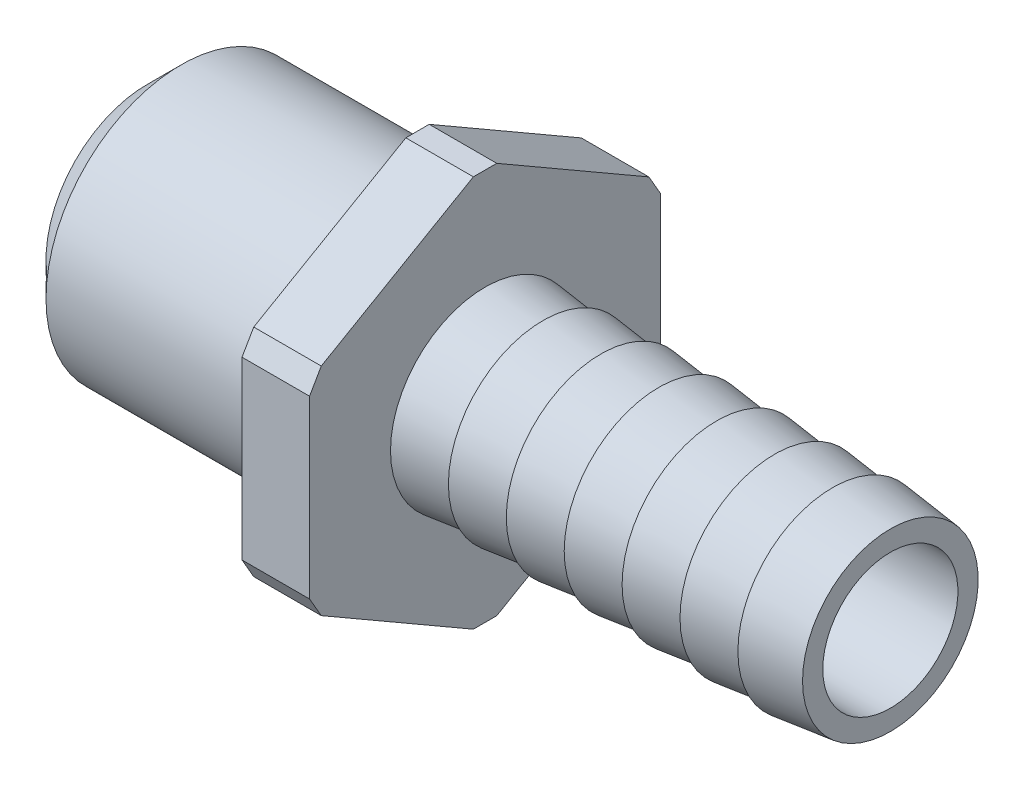
ISO-10303-21;
HEADER;
FILE_DESCRIPTION(('STEP AP214'),'2;1');
FILE_NAME('part.step','',(''),(''),'','','');
FILE_SCHEMA(('AUTOMOTIVE_DESIGN { 1 0 10303 214 1 1 1 1 }'));
ENDSEC;
DATA;
#1=APPLICATION_CONTEXT('core data for automotive mechanical design processes');
#2=APPLICATION_PROTOCOL_DEFINITION('international standard','automotive_design',2000,#1);
#3=PRODUCT_CONTEXT('',#1,'mechanical');
#4=PRODUCT('Part','Part','',(#3));
#5=PRODUCT_RELATED_PRODUCT_CATEGORY('part','',(#4));
#6=PRODUCT_DEFINITION_FORMATION('','',#4);
#7=PRODUCT_DEFINITION_CONTEXT('part definition',#1,'design');
#8=PRODUCT_DEFINITION('design','',#6,#7);
#9=PRODUCT_DEFINITION_SHAPE('','',#8);
#10=(LENGTH_UNIT() NAMED_UNIT(*) SI_UNIT(.MILLI.,.METRE.));
#11=(NAMED_UNIT(*) PLANE_ANGLE_UNIT() SI_UNIT($,.RADIAN.));
#12=(NAMED_UNIT(*) SI_UNIT($,.STERADIAN.) SOLID_ANGLE_UNIT());
#13=UNCERTAINTY_MEASURE_WITH_UNIT(LENGTH_MEASURE(1.E-05),#10,'distance_accuracy_value','');
#14=(GEOMETRIC_REPRESENTATION_CONTEXT(3) GLOBAL_UNCERTAINTY_ASSIGNED_CONTEXT((#13)) GLOBAL_UNIT_ASSIGNED_CONTEXT((#10,
#11,#12)) REPRESENTATION_CONTEXT('',''));
#15=CARTESIAN_POINT('',(0.,0.,0.));
#16=DIRECTION('',(0.,0.,1.));
#17=DIRECTION('',(1.,0.,0.));
#18=AXIS2_PLACEMENT_3D('',#15,#16,#17);
#19=CARTESIAN_POINT('',(4.,2.,0.));
#20=DIRECTION('',(1.,0.,0.));
#21=DIRECTION('',(0.,0.,-1.));
#22=AXIS2_PLACEMENT_3D('',#19,#20,#21);
#23=PLANE('',#22);
#24=CARTESIAN_POINT('',(4.,0.,0.));
#25=DIRECTION('',(-1.,0.,0.));
#26=DIRECTION('',(0.,0.,1.));
#27=AXIS2_PLACEMENT_3D('',#24,#25,#26);
#28=CIRCLE('',#27,2.);
#29=CARTESIAN_POINT('',(4.,0.,2.));
#30=VERTEX_POINT('',#29);
#31=EDGE_CURVE('E269',#30,#30,#28,.T.);
#32=ORIENTED_EDGE('',*,*,#31,.F.);
#33=EDGE_LOOP('',(#32));
#34=FACE_BOUND('',#33,.T.);
#35=DIRECTION('',(0.,-0.5,-0.866025403784439));
#36=VECTOR('',#35,1.);
#37=CARTESIAN_POINT('',(4.,3.,0.));
#38=LINE('',#37,#36);
#39=CARTESIAN_POINT('',(4.,2.9,-0.173205080756888));
#40=VERTEX_POINT('',#39);
#41=CARTESIAN_POINT('',(4.,1.6,-2.42487113059643));
#42=VERTEX_POINT('',#41);
#43=EDGE_CURVE('E149',#40,#42,#38,.T.);
#44=ORIENTED_EDGE('',*,*,#43,.T.);
#45=DIRECTION('',(0.,0.866025403784439,0.499999999999999));
#46=VECTOR('',#45,1.);
#47=CARTESIAN_POINT('',(4.,1.6,-2.42487113059643));
#48=LINE('',#47,#46);
#49=CARTESIAN_POINT('',(4.,1.3,-2.59807621135332));
#50=VERTEX_POINT('',#49);
#51=EDGE_CURVE('E294',#42,#50,#48,.F.);
#52=ORIENTED_EDGE('',*,*,#51,.T.);
#53=DIRECTION('',(0.,-1.,0.));
#54=VECTOR('',#53,1.);
#55=CARTESIAN_POINT('',(4.,1.5,-2.59807621135332));
#56=LINE('',#55,#54);
#57=CARTESIAN_POINT('',(4.,-1.3,-2.59807621135332));
#58=VERTEX_POINT('',#57);
#59=EDGE_CURVE('E304',#50,#58,#56,.T.);
#60=ORIENTED_EDGE('',*,*,#59,.T.);
#61=DIRECTION('',(0.,0.866025403784439,-0.499999999999999));
#62=VECTOR('',#61,1.);
#63=CARTESIAN_POINT('',(4.,-1.3,-2.59807621135332));
#64=LINE('',#63,#62);
#65=CARTESIAN_POINT('',(4.,-1.6,-2.42487113059643));
#66=VERTEX_POINT('',#65);
#67=EDGE_CURVE('E292',#58,#66,#64,.F.);
#68=ORIENTED_EDGE('',*,*,#67,.T.);
#69=DIRECTION('',(0.,-0.5,0.866025403784439));
#70=VECTOR('',#69,1.);
#71=CARTESIAN_POINT('',(4.,-1.5,-2.59807621135332));
#72=LINE('',#71,#70);
#73=CARTESIAN_POINT('',(4.,-2.9,-0.173205080756889));
#74=VERTEX_POINT('',#73);
#75=EDGE_CURVE('E221',#66,#74,#72,.T.);
#76=ORIENTED_EDGE('',*,*,#75,.T.);
#77=DIRECTION('',(0.,0.,-1.));
#78=VECTOR('',#77,1.);
#79=CARTESIAN_POINT('',(4.,-2.9,-0.173205080756889));
#80=LINE('',#79,#78);
#81=CARTESIAN_POINT('',(4.,-2.9,0.173205080756888));
#82=VERTEX_POINT('',#81);
#83=EDGE_CURVE('E290',#74,#82,#80,.F.);
#84=ORIENTED_EDGE('',*,*,#83,.T.);
#85=DIRECTION('',(0.,0.5,0.866025403784439));
#86=VECTOR('',#85,1.);
#87=CARTESIAN_POINT('',(4.,-3.,0.));
#88=LINE('',#87,#86);
#89=CARTESIAN_POINT('',(4.,-1.6,2.42487113059643));
#90=VERTEX_POINT('',#89);
#91=EDGE_CURVE('E216',#82,#90,#88,.T.);
#92=ORIENTED_EDGE('',*,*,#91,.T.);
#93=DIRECTION('',(0.,-0.866025403784439,-0.499999999999999));
#94=VECTOR('',#93,1.);
#95=CARTESIAN_POINT('',(4.,-1.6,2.42487113059643));
#96=LINE('',#95,#94);
#97=CARTESIAN_POINT('',(4.,-1.3,2.59807621135331));
#98=VERTEX_POINT('',#97);
#99=EDGE_CURVE('E214',#90,#98,#96,.F.);
#100=ORIENTED_EDGE('',*,*,#99,.T.);
#101=DIRECTION('',(0.,1.,0.));
#102=VECTOR('',#101,1.);
#103=CARTESIAN_POINT('',(4.,-1.5,2.59807621135331));
#104=LINE('',#103,#102);
#105=CARTESIAN_POINT('',(4.,1.3,2.59807621135331));
#106=VERTEX_POINT('',#105);
#107=EDGE_CURVE('E210',#98,#106,#104,.T.);
#108=ORIENTED_EDGE('',*,*,#107,.T.);
#109=DIRECTION('',(0.,-0.866025403784438,0.500000000000002));
#110=VECTOR('',#109,1.);
#111=CARTESIAN_POINT('',(4.,1.3,2.59807621135331));
#112=LINE('',#111,#110);
#113=CARTESIAN_POINT('',(4.,1.6,2.42487113059643));
#114=VERTEX_POINT('',#113);
#115=EDGE_CURVE('E205',#106,#114,#112,.F.);
#116=ORIENTED_EDGE('',*,*,#115,.T.);
#117=DIRECTION('',(0.,0.5,-0.866025403784439));
#118=VECTOR('',#117,1.);
#119=CARTESIAN_POINT('',(4.,1.5,2.59807621135331));
#120=LINE('',#119,#118);
#121=CARTESIAN_POINT('',(4.,2.9,0.173205080756888));
#122=VERTEX_POINT('',#121);
#123=EDGE_CURVE('E197',#114,#122,#120,.T.);
#124=ORIENTED_EDGE('',*,*,#123,.T.);
#125=DIRECTION('',(0.,0.,1.));
#126=VECTOR('',#125,1.);
#127=CARTESIAN_POINT('',(4.,2.9,0.173205080756888));
#128=LINE('',#127,#126);
#129=EDGE_CURVE('E287',#122,#40,#128,.F.);
#130=ORIENTED_EDGE('',*,*,#129,.T.);
#131=EDGE_LOOP('',(#44,#52,#60,#68,#76,#84,#92,#100,#108,#116,#124,#130));
#132=FACE_BOUND('',#131,.T.);
#133=ADVANCED_FACE('F49',(#34,#132),#23,.F.);
#134=CARTESIAN_POINT('',(5.,3.,0.));
#135=DIRECTION('',(-1.,0.,0.));
#136=DIRECTION('',(0.,0.,1.));
#137=AXIS2_PLACEMENT_3D('',#134,#135,#136);
#138=PLANE('',#137);
#139=CARTESIAN_POINT('',(5.,0.,0.));
#140=DIRECTION('',(-1.,0.,0.));
#141=DIRECTION('',(0.,0.,1.));
#142=AXIS2_PLACEMENT_3D('',#139,#140,#141);
#143=CIRCLE('',#142,1.4);
#144=CARTESIAN_POINT('',(5.,0.,1.4));
#145=VERTEX_POINT('',#144);
#146=EDGE_CURVE('E266',#145,#145,#143,.T.);
#147=ORIENTED_EDGE('',*,*,#146,.T.);
#148=EDGE_LOOP('',(#147));
#149=FACE_BOUND('',#148,.T.);
#150=DIRECTION('',(0.,-1.,0.));
#151=VECTOR('',#150,1.);
#152=CARTESIAN_POINT('',(5.,3.,-2.59807621135332));
#153=LINE('',#152,#151);
#154=CARTESIAN_POINT('',(5.,1.3,-2.59807621135332));
#155=VERTEX_POINT('',#154);
#156=CARTESIAN_POINT('',(5.,-1.3,-2.59807621135332));
#157=VERTEX_POINT('',#156);
#158=EDGE_CURVE('E162',#155,#157,#153,.T.);
#159=ORIENTED_EDGE('',*,*,#158,.F.);
#160=DIRECTION('',(0.,-0.866025403784439,-0.499999999999999));
#161=VECTOR('',#160,1.);
#162=CARTESIAN_POINT('',(5.,1.6,-2.42487113059643));
#163=LINE('',#162,#161);
#164=CARTESIAN_POINT('',(5.,1.6,-2.42487113059643));
#165=VERTEX_POINT('',#164);
#166=EDGE_CURVE('E161',#155,#165,#163,.F.);
#167=ORIENTED_EDGE('',*,*,#166,.T.);
#168=DIRECTION('',(0.,-0.5,-0.866025403784439));
#169=VECTOR('',#168,1.);
#170=CARTESIAN_POINT('',(5.,3.,0.));
#171=LINE('',#170,#169);
#172=CARTESIAN_POINT('',(5.,2.9,-0.173205080756888));
#173=VERTEX_POINT('',#172);
#174=EDGE_CURVE('E146',#173,#165,#171,.T.);
#175=ORIENTED_EDGE('',*,*,#174,.F.);
#176=DIRECTION('',(0.,0.,-1.));
#177=VECTOR('',#176,1.);
#178=CARTESIAN_POINT('',(5.,2.9,0.173205080756888));
#179=LINE('',#178,#177);
#180=CARTESIAN_POINT('',(5.,2.9,0.173205080756888));
#181=VERTEX_POINT('',#180);
#182=EDGE_CURVE('E158',#173,#181,#179,.F.);
#183=ORIENTED_EDGE('',*,*,#182,.T.);
#184=DIRECTION('',(0.,0.5,-0.866025403784439));
#185=VECTOR('',#184,1.);
#186=CARTESIAN_POINT('',(5.,3.,0.));
#187=LINE('',#186,#185);
#188=CARTESIAN_POINT('',(5.,1.6,2.42487113059643));
#189=VERTEX_POINT('',#188);
#190=EDGE_CURVE('E153',#189,#181,#187,.T.);
#191=ORIENTED_EDGE('',*,*,#190,.F.);
#192=DIRECTION('',(0.,0.866025403784438,-0.500000000000002));
#193=VECTOR('',#192,1.);
#194=CARTESIAN_POINT('',(5.,1.3,2.59807621135331));
#195=LINE('',#194,#193);
#196=CARTESIAN_POINT('',(5.,1.3,2.59807621135331));
#197=VERTEX_POINT('',#196);
#198=EDGE_CURVE('E168',#189,#197,#195,.F.);
#199=ORIENTED_EDGE('',*,*,#198,.T.);
#200=DIRECTION('',(0.,1.,0.));
#201=VECTOR('',#200,1.);
#202=CARTESIAN_POINT('',(5.,3.,2.59807621135331));
#203=LINE('',#202,#201);
#204=CARTESIAN_POINT('',(5.,-1.3,2.59807621135331));
#205=VERTEX_POINT('',#204);
#206=EDGE_CURVE('E202',#205,#197,#203,.T.);
#207=ORIENTED_EDGE('',*,*,#206,.F.);
#208=DIRECTION('',(0.,0.866025403784439,0.499999999999999));
#209=VECTOR('',#208,1.);
#210=CARTESIAN_POINT('',(5.,-1.6,2.42487113059643));
#211=LINE('',#210,#209);
#212=CARTESIAN_POINT('',(5.,-1.6,2.42487113059643));
#213=VERTEX_POINT('',#212);
#214=EDGE_CURVE('E167',#205,#213,#211,.F.);
#215=ORIENTED_EDGE('',*,*,#214,.T.);
#216=DIRECTION('',(0.,0.5,0.866025403784439));
#217=VECTOR('',#216,1.);
#218=CARTESIAN_POINT('',(5.,-1.5,2.59807621135332));
#219=LINE('',#218,#217);
#220=CARTESIAN_POINT('',(5.,-2.9,0.173205080756887));
#221=VERTEX_POINT('',#220);
#222=EDGE_CURVE('E281',#221,#213,#219,.T.);
#223=ORIENTED_EDGE('',*,*,#222,.F.);
#224=DIRECTION('',(0.,0.,1.));
#225=VECTOR('',#224,1.);
#226=CARTESIAN_POINT('',(5.,-2.9,-0.173205080756889));
#227=LINE('',#226,#225);
#228=CARTESIAN_POINT('',(5.,-2.9,-0.173205080756888));
#229=VERTEX_POINT('',#228);
#230=EDGE_CURVE('E65',#221,#229,#227,.F.);
#231=ORIENTED_EDGE('',*,*,#230,.T.);
#232=DIRECTION('',(0.,-0.5,0.866025403784439));
#233=VECTOR('',#232,1.);
#234=CARTESIAN_POINT('',(5.,-1.5,-2.59807621135332));
#235=LINE('',#234,#233);
#236=CARTESIAN_POINT('',(5.,-1.6,-2.42487113059643));
#237=VERTEX_POINT('',#236);
#238=EDGE_CURVE('E279',#237,#229,#235,.T.);
#239=ORIENTED_EDGE('',*,*,#238,.F.);
#240=DIRECTION('',(0.,-0.866025403784439,0.499999999999999));
#241=VECTOR('',#240,1.);
#242=CARTESIAN_POINT('',(5.,-1.3,-2.59807621135332));
#243=LINE('',#242,#241);
#244=EDGE_CURVE('E176',#237,#157,#243,.F.);
#245=ORIENTED_EDGE('',*,*,#244,.T.);
#246=EDGE_LOOP('',(#159,#167,#175,#183,#191,#199,#207,#215,#223,#231,#239,#245));
#247=FACE_BOUND('',#246,.T.);
#248=ADVANCED_FACE('F156',(#149,#247),#138,.F.);
#249=CARTESIAN_POINT('',(0.,1.,0.));
#250=DIRECTION('',(1.,0.,0.));
#251=DIRECTION('',(0.,0.,-1.));
#252=AXIS2_PLACEMENT_3D('',#249,#250,#251);
#253=PLANE('',#252);
#254=CARTESIAN_POINT('',(0.,0.,0.));
#255=DIRECTION('',(1.,0.,0.));
#256=DIRECTION('',(0.,0.,-1.));
#257=AXIS2_PLACEMENT_3D('',#254,#255,#256);
#258=CIRCLE('',#257,1.5);
#259=CARTESIAN_POINT('',(0.,0.,-1.5));
#260=VERTEX_POINT('',#259);
#261=EDGE_CURVE('E272',#260,#260,#258,.F.);
#262=ORIENTED_EDGE('',*,*,#261,.T.);
#263=EDGE_LOOP('',(#262));
#264=FACE_BOUND('',#263,.T.);
#265=CARTESIAN_POINT('',(0.,0.,0.));
#266=DIRECTION('',(-1.,0.,0.));
#267=DIRECTION('',(0.,0.,1.));
#268=AXIS2_PLACEMENT_3D('',#265,#266,#267);
#269=CIRCLE('',#268,1.);
#270=CARTESIAN_POINT('',(0.,0.,1.));
#271=VERTEX_POINT('',#270);
#272=EDGE_CURVE('E215',#271,#271,#269,.T.);
#273=ORIENTED_EDGE('',*,*,#272,.F.);
#274=EDGE_LOOP('',(#273));
#275=FACE_BOUND('',#274,.T.);
#276=ADVANCED_FACE('F336',(#264,#275),#253,.F.);
#277=CARTESIAN_POINT('',(0.,0.,0.));
#278=DIRECTION('',(-1.,0.,0.));
#279=DIRECTION('',(0.,0.,1.));
#280=AXIS2_PLACEMENT_3D('',#277,#278,#279);
#281=CYLINDRICAL_SURFACE('',#280,2.);
#282=CARTESIAN_POINT('',(0.5,0.,0.));
#283=DIRECTION('',(1.,0.,0.));
#284=DIRECTION('',(0.,0.,-1.));
#285=AXIS2_PLACEMENT_3D('',#282,#283,#284);
#286=CIRCLE('',#285,2.);
#287=CARTESIAN_POINT('',(0.5,0.,-2.));
#288=VERTEX_POINT('',#287);
#289=EDGE_CURVE('E163',#288,#288,#286,.T.);
#290=ORIENTED_EDGE('',*,*,#289,.T.);
#291=EDGE_LOOP('',(#290));
#292=FACE_BOUND('',#291,.T.);
#293=ORIENTED_EDGE('',*,*,#31,.T.);
#294=EDGE_LOOP('',(#293));
#295=FACE_BOUND('',#294,.T.);
#296=ADVANCED_FACE('F342',(#292,#295),#281,.T.);
#297=CARTESIAN_POINT('',(5.85714285714286,0.,0.));
#298=DIRECTION('',(-1.,0.,0.));
#299=DIRECTION('',(0.,0.,1.));
#300=AXIS2_PLACEMENT_3D('',#297,#298,#299);
#301=CONICAL_SURFACE('',#300,1.3,0.11614162687999);
#302=ORIENTED_EDGE('',*,*,#146,.F.);
#303=EDGE_LOOP('',(#302));
#304=FACE_BOUND('',#303,.T.);
#305=CARTESIAN_POINT('',(5.85714285714286,0.,0.));
#306=DIRECTION('',(-1.,0.,0.));
#307=DIRECTION('',(0.,0.,1.));
#308=AXIS2_PLACEMENT_3D('',#305,#306,#307);
#309=CIRCLE('',#308,1.3);
#310=CARTESIAN_POINT('',(5.85714285714286,0.,1.3));
#311=VERTEX_POINT('',#310);
#312=EDGE_CURVE('E263',#311,#311,#309,.T.);
#313=ORIENTED_EDGE('',*,*,#312,.T.);
#314=EDGE_LOOP('',(#313));
#315=FACE_BOUND('',#314,.T.);
#316=ADVANCED_FACE('F345',(#304,#315),#301,.T.);
#317=CARTESIAN_POINT('',(5.85714285714286,1.4,0.));
#318=DIRECTION('',(1.,0.,0.));
#319=DIRECTION('',(0.,0.,-1.));
#320=AXIS2_PLACEMENT_3D('',#317,#318,#319);
#321=PLANE('',#320);
#322=ORIENTED_EDGE('',*,*,#312,.F.);
#323=EDGE_LOOP('',(#322));
#324=FACE_BOUND('',#323,.T.);
#325=CARTESIAN_POINT('',(5.85714285714286,0.,0.));
#326=DIRECTION('',(-1.,0.,0.));
#327=DIRECTION('',(0.,0.,1.));
#328=AXIS2_PLACEMENT_3D('',#325,#326,#327);
#329=CIRCLE('',#328,1.4);
#330=CARTESIAN_POINT('',(5.85714285714286,0.,1.4));
#331=VERTEX_POINT('',#330);
#332=EDGE_CURVE('E260',#331,#331,#329,.T.);
#333=ORIENTED_EDGE('',*,*,#332,.T.);
#334=EDGE_LOOP('',(#333));
#335=FACE_BOUND('',#334,.T.);
#336=ADVANCED_FACE('F452',(#324,#335),#321,.F.);
#337=CARTESIAN_POINT('',(6.71428571428571,0.,0.));
#338=DIRECTION('',(-1.,0.,0.));
#339=DIRECTION('',(0.,0.,1.));
#340=AXIS2_PLACEMENT_3D('',#337,#338,#339);
#341=CONICAL_SURFACE('',#340,1.3,0.11614162687999);
#342=ORIENTED_EDGE('',*,*,#332,.F.);
#343=EDGE_LOOP('',(#342));
#344=FACE_BOUND('',#343,.T.);
#345=CARTESIAN_POINT('',(6.71428571428571,0.,0.));
#346=DIRECTION('',(-1.,0.,0.));
#347=DIRECTION('',(0.,0.,1.));
#348=AXIS2_PLACEMENT_3D('',#345,#346,#347);
#349=CIRCLE('',#348,1.3);
#350=CARTESIAN_POINT('',(6.71428571428571,0.,1.3));
#351=VERTEX_POINT('',#350);
#352=EDGE_CURVE('E257',#351,#351,#349,.T.);
#353=ORIENTED_EDGE('',*,*,#352,.T.);
#354=EDGE_LOOP('',(#353));
#355=FACE_BOUND('',#354,.T.);
#356=ADVANCED_FACE('F448',(#344,#355),#341,.T.);
#357=CARTESIAN_POINT('',(6.71428571428571,1.4,0.));
#358=DIRECTION('',(1.,0.,0.));
#359=DIRECTION('',(0.,0.,-1.));
#360=AXIS2_PLACEMENT_3D('',#357,#358,#359);
#361=PLANE('',#360);
#362=ORIENTED_EDGE('',*,*,#352,.F.);
#363=EDGE_LOOP('',(#362));
#364=FACE_BOUND('',#363,.T.);
#365=CARTESIAN_POINT('',(6.71428571428571,0.,0.));
#366=DIRECTION('',(-1.,0.,0.));
#367=DIRECTION('',(0.,0.,1.));
#368=AXIS2_PLACEMENT_3D('',#365,#366,#367);
#369=CIRCLE('',#368,1.4);
#370=CARTESIAN_POINT('',(6.71428571428571,0.,1.4));
#371=VERTEX_POINT('',#370);
#372=EDGE_CURVE('E254',#371,#371,#369,.T.);
#373=ORIENTED_EDGE('',*,*,#372,.T.);
#374=EDGE_LOOP('',(#373));
#375=FACE_BOUND('',#374,.T.);
#376=ADVANCED_FACE('F444',(#364,#375),#361,.F.);
#377=CARTESIAN_POINT('',(7.57142857142857,0.,0.));
#378=DIRECTION('',(-1.,0.,0.));
#379=DIRECTION('',(0.,0.,1.));
#380=AXIS2_PLACEMENT_3D('',#377,#378,#379);
#381=CONICAL_SURFACE('',#380,1.3,0.11614162687999);
#382=ORIENTED_EDGE('',*,*,#372,.F.);
#383=EDGE_LOOP('',(#382));
#384=FACE_BOUND('',#383,.T.);
#385=CARTESIAN_POINT('',(7.57142857142857,0.,0.));
#386=DIRECTION('',(-1.,0.,0.));
#387=DIRECTION('',(0.,0.,1.));
#388=AXIS2_PLACEMENT_3D('',#385,#386,#387);
#389=CIRCLE('',#388,1.3);
#390=CARTESIAN_POINT('',(7.57142857142857,0.,1.3));
#391=VERTEX_POINT('',#390);
#392=EDGE_CURVE('E251',#391,#391,#389,.T.);
#393=ORIENTED_EDGE('',*,*,#392,.T.);
#394=EDGE_LOOP('',(#393));
#395=FACE_BOUND('',#394,.T.);
#396=ADVANCED_FACE('F440',(#384,#395),#381,.T.);
#397=CARTESIAN_POINT('',(7.57142857142857,1.4,0.));
#398=DIRECTION('',(1.,0.,0.));
#399=DIRECTION('',(0.,0.,-1.));
#400=AXIS2_PLACEMENT_3D('',#397,#398,#399);
#401=PLANE('',#400);
#402=ORIENTED_EDGE('',*,*,#392,.F.);
#403=EDGE_LOOP('',(#402));
#404=FACE_BOUND('',#403,.T.);
#405=CARTESIAN_POINT('',(7.57142857142857,0.,0.));
#406=DIRECTION('',(-1.,0.,0.));
#407=DIRECTION('',(0.,0.,1.));
#408=AXIS2_PLACEMENT_3D('',#405,#406,#407);
#409=CIRCLE('',#408,1.4);
#410=CARTESIAN_POINT('',(7.57142857142857,0.,1.4));
#411=VERTEX_POINT('',#410);
#412=EDGE_CURVE('E248',#411,#411,#409,.T.);
#413=ORIENTED_EDGE('',*,*,#412,.T.);
#414=EDGE_LOOP('',(#413));
#415=FACE_BOUND('',#414,.T.);
#416=ADVANCED_FACE('F436',(#404,#415),#401,.F.);
#417=CARTESIAN_POINT('',(8.42857142857143,0.,0.));
#418=DIRECTION('',(-1.,0.,0.));
#419=DIRECTION('',(0.,0.,1.));
#420=AXIS2_PLACEMENT_3D('',#417,#418,#419);
#421=CONICAL_SURFACE('',#420,1.3,0.11614162687999);
#422=ORIENTED_EDGE('',*,*,#412,.F.);
#423=EDGE_LOOP('',(#422));
#424=FACE_BOUND('',#423,.T.);
#425=CARTESIAN_POINT('',(8.42857142857143,0.,0.));
#426=DIRECTION('',(-1.,0.,0.));
#427=DIRECTION('',(0.,0.,1.));
#428=AXIS2_PLACEMENT_3D('',#425,#426,#427);
#429=CIRCLE('',#428,1.3);
#430=CARTESIAN_POINT('',(8.42857142857143,0.,1.3));
#431=VERTEX_POINT('',#430);
#432=EDGE_CURVE('E245',#431,#431,#429,.T.);
#433=ORIENTED_EDGE('',*,*,#432,.T.);
#434=EDGE_LOOP('',(#433));
#435=FACE_BOUND('',#434,.T.);
#436=ADVANCED_FACE('F432',(#424,#435),#421,.T.);
#437=CARTESIAN_POINT('',(8.42857142857143,1.4,0.));
#438=DIRECTION('',(1.,0.,0.));
#439=DIRECTION('',(0.,0.,-1.));
#440=AXIS2_PLACEMENT_3D('',#437,#438,#439);
#441=PLANE('',#440);
#442=ORIENTED_EDGE('',*,*,#432,.F.);
#443=EDGE_LOOP('',(#442));
#444=FACE_BOUND('',#443,.T.);
#445=CARTESIAN_POINT('',(8.42857142857143,0.,0.));
#446=DIRECTION('',(-1.,0.,0.));
#447=DIRECTION('',(0.,0.,1.));
#448=AXIS2_PLACEMENT_3D('',#445,#446,#447);
#449=CIRCLE('',#448,1.4);
#450=CARTESIAN_POINT('',(8.42857142857143,0.,1.4));
#451=VERTEX_POINT('',#450);
#452=EDGE_CURVE('E242',#451,#451,#449,.T.);
#453=ORIENTED_EDGE('',*,*,#452,.T.);
#454=EDGE_LOOP('',(#453));
#455=FACE_BOUND('',#454,.T.);
#456=ADVANCED_FACE('F428',(#444,#455),#441,.F.);
#457=CARTESIAN_POINT('',(9.28571428571429,0.,0.));
#458=DIRECTION('',(-1.,0.,0.));
#459=DIRECTION('',(0.,0.,1.));
#460=AXIS2_PLACEMENT_3D('',#457,#458,#459);
#461=CONICAL_SURFACE('',#460,1.3,0.116141626879991);
#462=ORIENTED_EDGE('',*,*,#452,.F.);
#463=EDGE_LOOP('',(#462));
#464=FACE_BOUND('',#463,.T.);
#465=CARTESIAN_POINT('',(9.28571428571429,0.,0.));
#466=DIRECTION('',(-1.,0.,0.));
#467=DIRECTION('',(0.,0.,1.));
#468=AXIS2_PLACEMENT_3D('',#465,#466,#467);
#469=CIRCLE('',#468,1.3);
#470=CARTESIAN_POINT('',(9.28571428571429,0.,1.3));
#471=VERTEX_POINT('',#470);
#472=EDGE_CURVE('E239',#471,#471,#469,.T.);
#473=ORIENTED_EDGE('',*,*,#472,.T.);
#474=EDGE_LOOP('',(#473));
#475=FACE_BOUND('',#474,.T.);
#476=ADVANCED_FACE('F424',(#464,#475),#461,.T.);
#477=CARTESIAN_POINT('',(9.28571428571429,1.4,0.));
#478=DIRECTION('',(1.,0.,0.));
#479=DIRECTION('',(0.,0.,-1.));
#480=AXIS2_PLACEMENT_3D('',#477,#478,#479);
#481=PLANE('',#480);
#482=ORIENTED_EDGE('',*,*,#472,.F.);
#483=EDGE_LOOP('',(#482));
#484=FACE_BOUND('',#483,.T.);
#485=CARTESIAN_POINT('',(9.28571428571429,0.,0.));
#486=DIRECTION('',(-1.,0.,0.));
#487=DIRECTION('',(0.,0.,1.));
#488=AXIS2_PLACEMENT_3D('',#485,#486,#487);
#489=CIRCLE('',#488,1.4);
#490=CARTESIAN_POINT('',(9.28571428571429,0.,1.4));
#491=VERTEX_POINT('',#490);
#492=EDGE_CURVE('E236',#491,#491,#489,.T.);
#493=ORIENTED_EDGE('',*,*,#492,.T.);
#494=EDGE_LOOP('',(#493));
#495=FACE_BOUND('',#494,.T.);
#496=ADVANCED_FACE('F420',(#484,#495),#481,.F.);
#497=CARTESIAN_POINT('',(10.1428571428571,0.,0.));
#498=DIRECTION('',(-1.,0.,0.));
#499=DIRECTION('',(0.,0.,1.));
#500=AXIS2_PLACEMENT_3D('',#497,#498,#499);
#501=CONICAL_SURFACE('',#500,1.3,0.11614162687999);
#502=ORIENTED_EDGE('',*,*,#492,.F.);
#503=EDGE_LOOP('',(#502));
#504=FACE_BOUND('',#503,.T.);
#505=CARTESIAN_POINT('',(10.1428571428571,0.,0.));
#506=DIRECTION('',(-1.,0.,0.));
#507=DIRECTION('',(0.,0.,1.));
#508=AXIS2_PLACEMENT_3D('',#505,#506,#507);
#509=CIRCLE('',#508,1.3);
#510=CARTESIAN_POINT('',(10.1428571428571,0.,1.3));
#511=VERTEX_POINT('',#510);
#512=EDGE_CURVE('E233',#511,#511,#509,.T.);
#513=ORIENTED_EDGE('',*,*,#512,.T.);
#514=EDGE_LOOP('',(#513));
#515=FACE_BOUND('',#514,.T.);
#516=ADVANCED_FACE('F416',(#504,#515),#501,.T.);
#517=CARTESIAN_POINT('',(10.1428571428571,1.4,0.));
#518=DIRECTION('',(1.,0.,0.));
#519=DIRECTION('',(0.,0.,-1.));
#520=AXIS2_PLACEMENT_3D('',#517,#518,#519);
#521=PLANE('',#520);
#522=ORIENTED_EDGE('',*,*,#512,.F.);
#523=EDGE_LOOP('',(#522));
#524=FACE_BOUND('',#523,.T.);
#525=CARTESIAN_POINT('',(10.1428571428571,0.,0.));
#526=DIRECTION('',(-1.,0.,0.));
#527=DIRECTION('',(0.,0.,1.));
#528=AXIS2_PLACEMENT_3D('',#525,#526,#527);
#529=CIRCLE('',#528,1.4);
#530=CARTESIAN_POINT('',(10.1428571428571,0.,1.4));
#531=VERTEX_POINT('',#530);
#532=EDGE_CURVE('E230',#531,#531,#529,.T.);
#533=ORIENTED_EDGE('',*,*,#532,.T.);
#534=EDGE_LOOP('',(#533));
#535=FACE_BOUND('',#534,.T.);
#536=ADVANCED_FACE('F412',(#524,#535),#521,.F.);
#537=CARTESIAN_POINT('',(11.,0.,0.));
#538=DIRECTION('',(-1.,0.,0.));
#539=DIRECTION('',(0.,0.,1.));
#540=AXIS2_PLACEMENT_3D('',#537,#538,#539);
#541=CONICAL_SURFACE('',#540,1.3,0.11614162687999);
#542=ORIENTED_EDGE('',*,*,#532,.F.);
#543=EDGE_LOOP('',(#542));
#544=FACE_BOUND('',#543,.T.);
#545=CARTESIAN_POINT('',(11.,0.,0.));
#546=DIRECTION('',(-1.,0.,0.));
#547=DIRECTION('',(0.,0.,1.));
#548=AXIS2_PLACEMENT_3D('',#545,#546,#547);
#549=CIRCLE('',#548,1.3);
#550=CARTESIAN_POINT('',(11.,0.,1.3));
#551=VERTEX_POINT('',#550);
#552=EDGE_CURVE('E227',#551,#551,#549,.T.);
#553=ORIENTED_EDGE('',*,*,#552,.T.);
#554=EDGE_LOOP('',(#553));
#555=FACE_BOUND('',#554,.T.);
#556=ADVANCED_FACE('F408',(#544,#555),#541,.T.);
#557=CARTESIAN_POINT('',(11.,1.3,0.));
#558=DIRECTION('',(-1.,0.,0.));
#559=DIRECTION('',(0.,0.,1.));
#560=AXIS2_PLACEMENT_3D('',#557,#558,#559);
#561=PLANE('',#560);
#562=ORIENTED_EDGE('',*,*,#552,.F.);
#563=EDGE_LOOP('',(#562));
#564=FACE_BOUND('',#563,.T.);
#565=CARTESIAN_POINT('',(11.,0.,0.));
#566=DIRECTION('',(-1.,0.,0.));
#567=DIRECTION('',(0.,0.,1.));
#568=AXIS2_PLACEMENT_3D('',#565,#566,#567);
#569=CIRCLE('',#568,1.);
#570=CARTESIAN_POINT('',(11.,0.,1.));
#571=VERTEX_POINT('',#570);
#572=EDGE_CURVE('E219',#571,#571,#569,.T.);
#573=ORIENTED_EDGE('',*,*,#572,.T.);
#574=EDGE_LOOP('',(#573));
#575=FACE_BOUND('',#574,.T.);
#576=ADVANCED_FACE('F404',(#564,#575),#561,.F.);
#577=CARTESIAN_POINT('',(0.,0.,0.));
#578=DIRECTION('',(-1.,0.,0.));
#579=DIRECTION('',(0.,0.,1.));
#580=AXIS2_PLACEMENT_3D('',#577,#578,#579);
#581=CYLINDRICAL_SURFACE('',#580,1.);
#582=ORIENTED_EDGE('',*,*,#572,.F.);
#583=EDGE_LOOP('',(#582));
#584=FACE_BOUND('',#583,.T.);
#585=ORIENTED_EDGE('',*,*,#272,.T.);
#586=EDGE_LOOP('',(#585));
#587=FACE_BOUND('',#586,.T.);
#588=ADVANCED_FACE('F356',(#584,#587),#581,.F.);
#589=CARTESIAN_POINT('',(0.,0.,0.));
#590=DIRECTION('',(1.,0.,0.));
#591=DIRECTION('',(0.,0.,-1.));
#592=AXIS2_PLACEMENT_3D('',#589,#590,#591);
#593=CONICAL_SURFACE('',#592,1.5,0.785398163397448);
#594=ORIENTED_EDGE('',*,*,#289,.F.);
#595=EDGE_LOOP('',(#594));
#596=FACE_BOUND('',#595,.T.);
#597=ORIENTED_EDGE('',*,*,#261,.F.);
#598=EDGE_LOOP('',(#597));
#599=FACE_BOUND('',#598,.T.);
#600=ADVANCED_FACE('F351',(#596,#599),#593,.T.);
#601=CARTESIAN_POINT('',(11.,1.5,2.59807621135331));
#602=DIRECTION('',(0.,0.866025403784439,0.5));
#603=DIRECTION('',(0.,-0.5,0.866025403784439));
#604=AXIS2_PLACEMENT_3D('',#601,#602,#603);
#605=PLANE('',#604);
#606=ORIENTED_EDGE('',*,*,#190,.T.);
#607=DIRECTION('',(-1.,0.,0.));
#608=VECTOR('',#607,1.);
#609=CARTESIAN_POINT('',(11.,2.9,0.173205080756888));
#610=LINE('',#609,#608);
#611=EDGE_CURVE('E11',#181,#122,#610,.T.);
#612=ORIENTED_EDGE('',*,*,#611,.T.);
#613=ORIENTED_EDGE('',*,*,#123,.F.);
#614=DIRECTION('',(1.,0.,0.));
#615=VECTOR('',#614,1.);
#616=CARTESIAN_POINT('',(11.,1.6,2.42487113059643));
#617=LINE('',#616,#615);
#618=EDGE_CURVE('E58',#114,#189,#617,.T.);
#619=ORIENTED_EDGE('',*,*,#618,.T.);
#620=EDGE_LOOP('',(#606,#612,#613,#619));
#621=FACE_BOUND('',#620,.T.);
#622=ADVANCED_FACE('F195',(#621),#605,.T.);
#623=CARTESIAN_POINT('',(11.,-1.5,2.59807621135331));
#624=DIRECTION('',(0.,0.,1.));
#625=DIRECTION('',(0.,-1.,0.));
#626=AXIS2_PLACEMENT_3D('',#623,#624,#625);
#627=PLANE('',#626);
#628=ORIENTED_EDGE('',*,*,#107,.F.);
#629=DIRECTION('',(1.,0.,0.));
#630=VECTOR('',#629,1.);
#631=CARTESIAN_POINT('',(11.,-1.3,2.59807621135331));
#632=LINE('',#631,#630);
#633=EDGE_CURVE('E191',#98,#205,#632,.T.);
#634=ORIENTED_EDGE('',*,*,#633,.T.);
#635=ORIENTED_EDGE('',*,*,#206,.T.);
#636=DIRECTION('',(-1.,0.,0.));
#637=VECTOR('',#636,1.);
#638=CARTESIAN_POINT('',(11.,1.3,2.59807621135331));
#639=LINE('',#638,#637);
#640=EDGE_CURVE('E188',#197,#106,#639,.T.);
#641=ORIENTED_EDGE('',*,*,#640,.T.);
#642=EDGE_LOOP('',(#628,#634,#635,#641));
#643=FACE_BOUND('',#642,.T.);
#644=ADVANCED_FACE('F209',(#643),#627,.T.);
#645=CARTESIAN_POINT('',(11.,-3.,0.));
#646=DIRECTION('',(0.,-0.866025403784439,0.5));
#647=DIRECTION('',(0.,-0.5,-0.866025403784439));
#648=AXIS2_PLACEMENT_3D('',#645,#646,#647);
#649=PLANE('',#648);
#650=ORIENTED_EDGE('',*,*,#91,.F.);
#651=DIRECTION('',(1.,0.,0.));
#652=VECTOR('',#651,1.);
#653=CARTESIAN_POINT('',(11.,-2.9,0.173205080756888));
#654=LINE('',#653,#652);
#655=EDGE_CURVE('E186',#82,#221,#654,.T.);
#656=ORIENTED_EDGE('',*,*,#655,.T.);
#657=ORIENTED_EDGE('',*,*,#222,.T.);
#658=DIRECTION('',(-1.,0.,0.));
#659=VECTOR('',#658,1.);
#660=CARTESIAN_POINT('',(11.,-1.6,2.42487113059643));
#661=LINE('',#660,#659);
#662=EDGE_CURVE('E183',#213,#90,#661,.T.);
#663=ORIENTED_EDGE('',*,*,#662,.T.);
#664=EDGE_LOOP('',(#650,#656,#657,#663));
#665=FACE_BOUND('',#664,.T.);
#666=ADVANCED_FACE('F385',(#665),#649,.T.);
#667=CARTESIAN_POINT('',(11.,-1.5,-2.59807621135332));
#668=DIRECTION('',(0.,-0.866025403784438,-0.5));
#669=DIRECTION('',(0.,0.5,-0.866025403784439));
#670=AXIS2_PLACEMENT_3D('',#667,#668,#669);
#671=PLANE('',#670);
#672=ORIENTED_EDGE('',*,*,#75,.F.);
#673=DIRECTION('',(1.,0.,0.));
#674=VECTOR('',#673,1.);
#675=CARTESIAN_POINT('',(11.,-1.6,-2.42487113059643));
#676=LINE('',#675,#674);
#677=EDGE_CURVE('E72',#66,#237,#676,.T.);
#678=ORIENTED_EDGE('',*,*,#677,.T.);
#679=ORIENTED_EDGE('',*,*,#238,.T.);
#680=DIRECTION('',(-1.,0.,0.));
#681=VECTOR('',#680,1.);
#682=CARTESIAN_POINT('',(11.,-2.9,-0.173205080756889));
#683=LINE('',#682,#681);
#684=EDGE_CURVE('E179',#229,#74,#683,.T.);
#685=ORIENTED_EDGE('',*,*,#684,.T.);
#686=EDGE_LOOP('',(#672,#678,#679,#685));
#687=FACE_BOUND('',#686,.T.);
#688=ADVANCED_FACE('F313',(#687),#671,.T.);
#689=CARTESIAN_POINT('',(11.,1.5,-2.59807621135332));
#690=DIRECTION('',(0.,0.,-1.));
#691=DIRECTION('',(0.,1.,0.));
#692=AXIS2_PLACEMENT_3D('',#689,#690,#691);
#693=PLANE('',#692);
#694=ORIENTED_EDGE('',*,*,#59,.F.);
#695=DIRECTION('',(1.,0.,0.));
#696=VECTOR('',#695,1.);
#697=CARTESIAN_POINT('',(11.,1.3,-2.59807621135332));
#698=LINE('',#697,#696);
#699=EDGE_CURVE('E171',#50,#155,#698,.T.);
#700=ORIENTED_EDGE('',*,*,#699,.T.);
#701=ORIENTED_EDGE('',*,*,#158,.T.);
#702=DIRECTION('',(-1.,0.,0.));
#703=VECTOR('',#702,1.);
#704=CARTESIAN_POINT('',(11.,-1.3,-2.59807621135332));
#705=LINE('',#704,#703);
#706=EDGE_CURVE('E296',#157,#58,#705,.T.);
#707=ORIENTED_EDGE('',*,*,#706,.T.);
#708=EDGE_LOOP('',(#694,#700,#701,#707));
#709=FACE_BOUND('',#708,.T.);
#710=ADVANCED_FACE('F301',(#709),#693,.T.);
#711=CARTESIAN_POINT('',(11.,3.,0.));
#712=DIRECTION('',(0.,0.866025403784439,-0.5));
#713=DIRECTION('',(0.,0.5,0.866025403784439));
#714=AXIS2_PLACEMENT_3D('',#711,#712,#713);
#715=PLANE('',#714);
#716=ORIENTED_EDGE('',*,*,#174,.T.);
#717=DIRECTION('',(-1.,0.,0.));
#718=VECTOR('',#717,1.);
#719=CARTESIAN_POINT('',(11.,1.6,-2.42487113059643));
#720=LINE('',#719,#718);
#721=EDGE_CURVE('E152',#165,#42,#720,.T.);
#722=ORIENTED_EDGE('',*,*,#721,.T.);
#723=ORIENTED_EDGE('',*,*,#43,.F.);
#724=DIRECTION('',(1.,0.,0.));
#725=VECTOR('',#724,1.);
#726=CARTESIAN_POINT('',(11.,2.9,-0.173205080756888));
#727=LINE('',#726,#725);
#728=EDGE_CURVE('E142',#40,#173,#727,.T.);
#729=ORIENTED_EDGE('',*,*,#728,.T.);
#730=EDGE_LOOP('',(#716,#722,#723,#729));
#731=FACE_BOUND('',#730,.T.);
#732=ADVANCED_FACE('F144',(#731),#715,.T.);
#733=CARTESIAN_POINT('',(11.,1.6,-2.42487113059643));
#734=DIRECTION('',(0.,-0.499999999999999,0.866025403784439));
#735=DIRECTION('',(-1.,0.,0.));
#736=AXIS2_PLACEMENT_3D('',#733,#734,#735);
#737=PLANE('',#736);
#738=ORIENTED_EDGE('',*,*,#166,.F.);
#739=ORIENTED_EDGE('',*,*,#699,.F.);
#740=ORIENTED_EDGE('',*,*,#51,.F.);
#741=ORIENTED_EDGE('',*,*,#721,.F.);
#742=EDGE_LOOP('',(#738,#739,#740,#741));
#743=FACE_BOUND('',#742,.T.);
#744=ADVANCED_FACE('F307',(#743),#737,.F.);
#745=CARTESIAN_POINT('',(11.,-1.3,-2.59807621135332));
#746=DIRECTION('',(0.,0.499999999999999,0.866025403784439));
#747=DIRECTION('',(-1.,0.,0.));
#748=AXIS2_PLACEMENT_3D('',#745,#746,#747);
#749=PLANE('',#748);
#750=ORIENTED_EDGE('',*,*,#244,.F.);
#751=ORIENTED_EDGE('',*,*,#677,.F.);
#752=ORIENTED_EDGE('',*,*,#67,.F.);
#753=ORIENTED_EDGE('',*,*,#706,.F.);
#754=EDGE_LOOP('',(#750,#751,#752,#753));
#755=FACE_BOUND('',#754,.T.);
#756=ADVANCED_FACE('F316',(#755),#749,.F.);
#757=CARTESIAN_POINT('',(11.,-2.9,-0.173205080756889));
#758=DIRECTION('',(0.,1.,0.));
#759=DIRECTION('',(-1.,0.,0.));
#760=AXIS2_PLACEMENT_3D('',#757,#758,#759);
#761=PLANE('',#760);
#762=ORIENTED_EDGE('',*,*,#230,.F.);
#763=ORIENTED_EDGE('',*,*,#655,.F.);
#764=ORIENTED_EDGE('',*,*,#83,.F.);
#765=ORIENTED_EDGE('',*,*,#684,.F.);
#766=EDGE_LOOP('',(#762,#763,#764,#765));
#767=FACE_BOUND('',#766,.T.);
#768=ADVANCED_FACE('F318',(#767),#761,.F.);
#769=CARTESIAN_POINT('',(11.,-1.6,2.42487113059643));
#770=DIRECTION('',(0.,0.499999999999999,-0.866025403784439));
#771=DIRECTION('',(-1.,0.,0.));
#772=AXIS2_PLACEMENT_3D('',#769,#770,#771);
#773=PLANE('',#772);
#774=ORIENTED_EDGE('',*,*,#214,.F.);
#775=ORIENTED_EDGE('',*,*,#633,.F.);
#776=ORIENTED_EDGE('',*,*,#99,.F.);
#777=ORIENTED_EDGE('',*,*,#662,.F.);
#778=EDGE_LOOP('',(#774,#775,#776,#777));
#779=FACE_BOUND('',#778,.T.);
#780=ADVANCED_FACE('F324',(#779),#773,.F.);
#781=CARTESIAN_POINT('',(11.,2.9,0.173205080756888));
#782=DIRECTION('',(0.,-1.,0.));
#783=DIRECTION('',(-1.,0.,0.));
#784=AXIS2_PLACEMENT_3D('',#781,#782,#783);
#785=PLANE('',#784);
#786=ORIENTED_EDGE('',*,*,#182,.F.);
#787=ORIENTED_EDGE('',*,*,#728,.F.);
#788=ORIENTED_EDGE('',*,*,#129,.F.);
#789=ORIENTED_EDGE('',*,*,#611,.F.);
#790=EDGE_LOOP('',(#786,#787,#788,#789));
#791=FACE_BOUND('',#790,.T.);
#792=ADVANCED_FACE('F166',(#791),#785,.F.);
#793=CARTESIAN_POINT('',(11.,1.3,2.59807621135331));
#794=DIRECTION('',(0.,-0.500000000000002,-0.866025403784438));
#795=DIRECTION('',(-1.,0.,0.));
#796=AXIS2_PLACEMENT_3D('',#793,#794,#795);
#797=PLANE('',#796);
#798=ORIENTED_EDGE('',*,*,#198,.F.);
#799=ORIENTED_EDGE('',*,*,#618,.F.);
#800=ORIENTED_EDGE('',*,*,#115,.F.);
#801=ORIENTED_EDGE('',*,*,#640,.F.);
#802=EDGE_LOOP('',(#798,#799,#800,#801));
#803=FACE_BOUND('',#802,.T.);
#804=ADVANCED_FACE('F52',(#803),#797,.F.);
#805=CLOSED_SHELL('',(#133,#248,#276,#296,#316,#336,#356,#376,#396,#416,#436,#456,#476,#496,
#516,#536,#556,#576,#588,#600,#622,#644,#666,#688,#710,#732,#744,#756,#768,#780,#792,#804));
#806=MANIFOLD_SOLID_BREP('B2',#805);
#807=ADVANCED_BREP_SHAPE_REPRESENTATION('',(#18,#806),#14);
#808=SHAPE_DEFINITION_REPRESENTATION(#9,#807);
ENDSEC;
END-ISO-10303-21;
